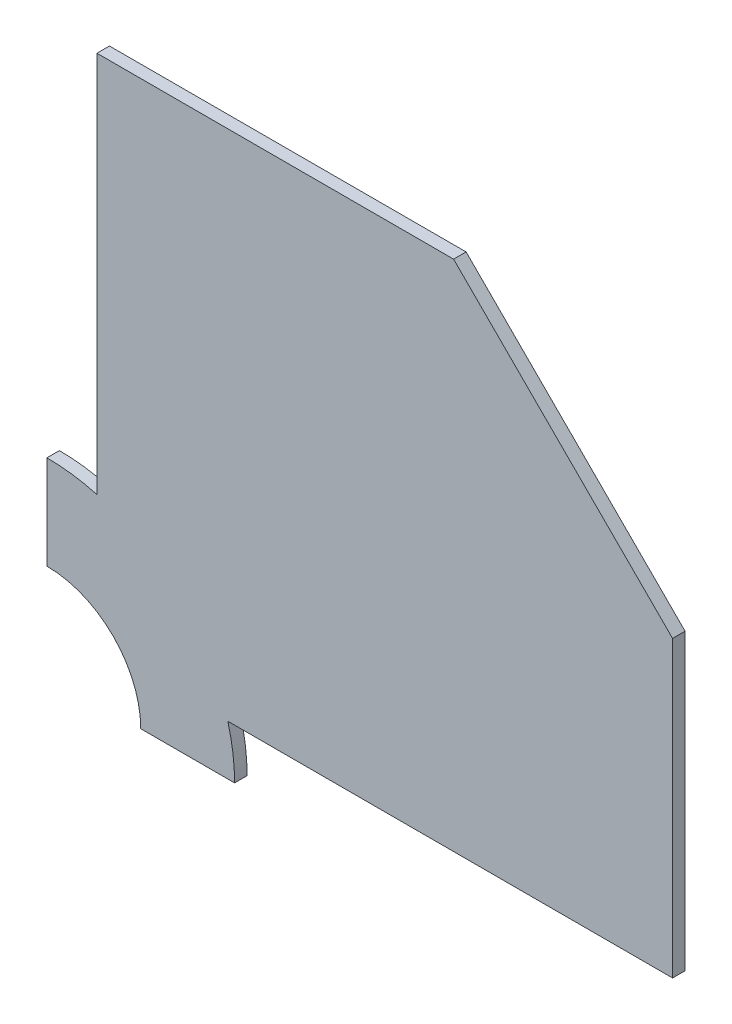
ISO-10303-21;
HEADER;
FILE_DESCRIPTION(('STEP AP214'),'2;1');
FILE_NAME('part.step','',(''),(''),'','','');
FILE_SCHEMA(('AUTOMOTIVE_DESIGN { 1 0 10303 214 1 1 1 1 }'));
ENDSEC;
DATA;
#1=APPLICATION_CONTEXT('core data for automotive mechanical design processes');
#2=APPLICATION_PROTOCOL_DEFINITION('international standard','automotive_design',2000,#1);
#3=PRODUCT_CONTEXT('',#1,'mechanical');
#4=PRODUCT('Part','Part','',(#3));
#5=PRODUCT_RELATED_PRODUCT_CATEGORY('part','',(#4));
#6=PRODUCT_DEFINITION_FORMATION('','',#4);
#7=PRODUCT_DEFINITION_CONTEXT('part definition',#1,'design');
#8=PRODUCT_DEFINITION('design','',#6,#7);
#9=PRODUCT_DEFINITION_SHAPE('','',#8);
#10=(LENGTH_UNIT() NAMED_UNIT(*) SI_UNIT(.MILLI.,.METRE.));
#11=(NAMED_UNIT(*) PLANE_ANGLE_UNIT() SI_UNIT($,.RADIAN.));
#12=(NAMED_UNIT(*) SI_UNIT($,.STERADIAN.) SOLID_ANGLE_UNIT());
#13=UNCERTAINTY_MEASURE_WITH_UNIT(LENGTH_MEASURE(1.E-05),#10,'distance_accuracy_value','');
#14=(GEOMETRIC_REPRESENTATION_CONTEXT(3) GLOBAL_UNCERTAINTY_ASSIGNED_CONTEXT((#13)) GLOBAL_UNIT_ASSIGNED_CONTEXT((#10,
#11,#12)) REPRESENTATION_CONTEXT('',''));
#15=CARTESIAN_POINT('',(0.,0.,0.));
#16=DIRECTION('',(0.,0.,1.));
#17=DIRECTION('',(1.,0.,0.));
#18=AXIS2_PLACEMENT_3D('',#15,#16,#17);
#19=CARTESIAN_POINT('',(-1.6,-1.25,-0.02));
#20=DIRECTION('',(0.,0.,-1.));
#21=DIRECTION('',(-1.,0.,0.));
#22=AXIS2_PLACEMENT_3D('',#19,#20,#21);
#23=PLANE('',#22);
#24=DIRECTION('',(0.,1.,0.));
#25=VECTOR('',#24,1.);
#26=CARTESIAN_POINT('',(-1.52,-0.960863354104,-0.02));
#27=LINE('',#26,#25);
#28=CARTESIAN_POINT('',(-1.52,-0.96086335410399,-0.02));
#29=VERTEX_POINT('',#28);
#30=CARTESIAN_POINT('',(-1.52,-0.35,-0.02));
#31=VERTEX_POINT('',#30);
#32=EDGE_CURVE('E115',#29,#31,#27,.T.);
#33=ORIENTED_EDGE('',*,*,#32,.T.);
#34=DIRECTION('',(1.,0.,0.));
#35=VECTOR('',#34,1.);
#36=CARTESIAN_POINT('',(-1.52,-0.35,-0.02));
#37=LINE('',#36,#35);
#38=CARTESIAN_POINT('',(-0.95,-0.35,-0.02));
#39=VERTEX_POINT('',#38);
#40=EDGE_CURVE('E98',#31,#39,#37,.T.);
#41=ORIENTED_EDGE('',*,*,#40,.T.);
#42=DIRECTION('',(0.707106781186548,-0.707106781186548,0.));
#43=VECTOR('',#42,1.);
#44=CARTESIAN_POINT('',(-0.95,-0.35,-0.02));
#45=LINE('',#44,#43);
#46=CARTESIAN_POINT('',(-0.6,-0.7,-0.02));
#47=VERTEX_POINT('',#46);
#48=EDGE_CURVE('E190',#39,#47,#45,.T.);
#49=ORIENTED_EDGE('',*,*,#48,.T.);
#50=DIRECTION('',(0.,1.,0.));
#51=VECTOR('',#50,1.);
#52=CARTESIAN_POINT('',(-0.6,-0.7,-0.02));
#53=LINE('',#52,#51);
#54=CARTESIAN_POINT('',(-0.6,-1.17,-0.02));
#55=VERTEX_POINT('',#54);
#56=EDGE_CURVE('E79',#47,#55,#53,.F.);
#57=ORIENTED_EDGE('',*,*,#56,.T.);
#58=DIRECTION('',(1.,0.,0.));
#59=VECTOR('',#58,1.);
#60=CARTESIAN_POINT('',(-0.6,-1.17,-0.02));
#61=LINE('',#60,#59);
#62=CARTESIAN_POINT('',(-1.31086335410398,-1.17,-0.02));
#63=VERTEX_POINT('',#62);
#64=EDGE_CURVE('E181',#55,#63,#61,.F.);
#65=ORIENTED_EDGE('',*,*,#64,.T.);
#66=CARTESIAN_POINT('',(-1.6,-1.25,-0.02));
#67=DIRECTION('',(0.,0.,1.));
#68=DIRECTION('',(1.,0.,0.));
#69=AXIS2_PLACEMENT_3D('',#66,#67,#68);
#70=CIRCLE('',#69,0.3);
#71=CARTESIAN_POINT('',(-1.3,-1.25,-0.02));
#72=VERTEX_POINT('',#71);
#73=EDGE_CURVE('E20',#72,#63,#70,.T.);
#74=ORIENTED_EDGE('',*,*,#73,.F.);
#75=DIRECTION('',(1.,0.,0.));
#76=VECTOR('',#75,1.);
#77=CARTESIAN_POINT('',(-1.3,-1.25,-0.02));
#78=LINE('',#77,#76);
#79=CARTESIAN_POINT('',(-1.45,-1.25,-0.02));
#80=VERTEX_POINT('',#79);
#81=EDGE_CURVE('E177',#72,#80,#78,.F.);
#82=ORIENTED_EDGE('',*,*,#81,.T.);
#83=CARTESIAN_POINT('',(-1.6,-1.25,-0.02));
#84=DIRECTION('',(0.,0.,1.));
#85=DIRECTION('',(1.,0.,0.));
#86=AXIS2_PLACEMENT_3D('',#83,#84,#85);
#87=CIRCLE('',#86,0.15);
#88=CARTESIAN_POINT('',(-1.6,-1.1,-0.02));
#89=VERTEX_POINT('',#88);
#90=EDGE_CURVE('E205',#80,#89,#87,.T.);
#91=ORIENTED_EDGE('',*,*,#90,.T.);
#92=DIRECTION('',(0.,1.,0.));
#93=VECTOR('',#92,1.);
#94=CARTESIAN_POINT('',(-1.6,-1.1,-0.02));
#95=LINE('',#94,#93);
#96=CARTESIAN_POINT('',(-1.6,-0.95,-0.02));
#97=VERTEX_POINT('',#96);
#98=EDGE_CURVE('E174',#89,#97,#95,.T.);
#99=ORIENTED_EDGE('',*,*,#98,.T.);
#100=CARTESIAN_POINT('',(-1.6,-1.25,-0.02));
#101=DIRECTION('',(0.,0.,1.));
#102=DIRECTION('',(1.,0.,0.));
#103=AXIS2_PLACEMENT_3D('',#100,#101,#102);
#104=CIRCLE('',#103,0.3);
#105=EDGE_CURVE('E164',#29,#97,#104,.T.);
#106=ORIENTED_EDGE('',*,*,#105,.F.);
#107=EDGE_LOOP('',(#33,#41,#49,#57,#65,#74,#82,#91,#99,#106));
#108=FACE_BOUND('',#107,.T.);
#109=ADVANCED_FACE('F17',(#108),#23,.T.);
#110=CARTESIAN_POINT('',(-1.52,-0.35,-0.02));
#111=DIRECTION('',(0.,-1.,0.));
#112=DIRECTION('',(0.,0.,-1.));
#113=AXIS2_PLACEMENT_3D('',#110,#111,#112);
#114=PLANE('',#113);
#115=ORIENTED_EDGE('',*,*,#40,.F.);
#116=DIRECTION('',(0.,0.,-1.));
#117=VECTOR('',#116,1.);
#118=CARTESIAN_POINT('',(-1.52,-0.35,-0.02));
#119=LINE('',#118,#117);
#120=CARTESIAN_POINT('',(-1.52,-0.35,0.));
#121=VERTEX_POINT('',#120);
#122=EDGE_CURVE('E111',#31,#121,#119,.F.);
#123=ORIENTED_EDGE('',*,*,#122,.T.);
#124=DIRECTION('',(-1.,0.,0.));
#125=VECTOR('',#124,1.);
#126=CARTESIAN_POINT('',(-1.6,-0.35,0.));
#127=LINE('',#126,#125);
#128=CARTESIAN_POINT('',(-0.95,-0.35,0.));
#129=VERTEX_POINT('',#128);
#130=EDGE_CURVE('E104',#121,#129,#127,.F.);
#131=ORIENTED_EDGE('',*,*,#130,.T.);
#132=DIRECTION('',(0.,0.,1.));
#133=VECTOR('',#132,1.);
#134=CARTESIAN_POINT('',(-0.95,-0.35,-0.02));
#135=LINE('',#134,#133);
#136=EDGE_CURVE('E192',#129,#39,#135,.F.);
#137=ORIENTED_EDGE('',*,*,#136,.T.);
#138=EDGE_LOOP('',(#115,#123,#131,#137));
#139=FACE_BOUND('',#138,.T.);
#140=ADVANCED_FACE('F113',(#139),#114,.F.);
#141=CARTESIAN_POINT('',(-0.95,-0.35,-0.02));
#142=DIRECTION('',(-0.707106781186548,-0.707106781186548,0.));
#143=DIRECTION('',(0.707106781186548,-0.707106781186548,0.));
#144=AXIS2_PLACEMENT_3D('',#141,#142,#143);
#145=PLANE('',#144);
#146=ORIENTED_EDGE('',*,*,#48,.F.);
#147=ORIENTED_EDGE('',*,*,#136,.F.);
#148=DIRECTION('',(0.707106781186547,-0.707106781186547,0.));
#149=VECTOR('',#148,1.);
#150=CARTESIAN_POINT('',(-0.95,-0.35,0.));
#151=LINE('',#150,#149);
#152=CARTESIAN_POINT('',(-0.6,-0.7,0.));
#153=VERTEX_POINT('',#152);
#154=EDGE_CURVE('E110',#129,#153,#151,.T.);
#155=ORIENTED_EDGE('',*,*,#154,.T.);
#156=DIRECTION('',(0.,0.,1.));
#157=VECTOR('',#156,1.);
#158=CARTESIAN_POINT('',(-0.6,-0.7,-0.02));
#159=LINE('',#158,#157);
#160=EDGE_CURVE('E187',#153,#47,#159,.F.);
#161=ORIENTED_EDGE('',*,*,#160,.T.);
#162=EDGE_LOOP('',(#146,#147,#155,#161));
#163=FACE_BOUND('',#162,.T.);
#164=ADVANCED_FACE('F152',(#163),#145,.F.);
#165=CARTESIAN_POINT('',(-0.6,-0.7,-0.02));
#166=DIRECTION('',(-1.,0.,0.));
#167=DIRECTION('',(0.,0.,1.));
#168=AXIS2_PLACEMENT_3D('',#165,#166,#167);
#169=PLANE('',#168);
#170=ORIENTED_EDGE('',*,*,#56,.F.);
#171=ORIENTED_EDGE('',*,*,#160,.F.);
#172=DIRECTION('',(0.,1.,0.));
#173=VECTOR('',#172,1.);
#174=CARTESIAN_POINT('',(-0.6,-1.25,0.));
#175=LINE('',#174,#173);
#176=CARTESIAN_POINT('',(-0.6,-1.17,0.));
#177=VERTEX_POINT('',#176);
#178=EDGE_CURVE('E222',#153,#177,#175,.F.);
#179=ORIENTED_EDGE('',*,*,#178,.T.);
#180=DIRECTION('',(0.,0.,1.));
#181=VECTOR('',#180,1.);
#182=CARTESIAN_POINT('',(-0.6,-1.17,-0.02));
#183=LINE('',#182,#181);
#184=EDGE_CURVE('E183',#177,#55,#183,.F.);
#185=ORIENTED_EDGE('',*,*,#184,.T.);
#186=EDGE_LOOP('',(#170,#171,#179,#185));
#187=FACE_BOUND('',#186,.T.);
#188=ADVANCED_FACE('F148',(#187),#169,.F.);
#189=CARTESIAN_POINT('',(-0.6,-1.17,-0.02));
#190=DIRECTION('',(0.,1.,0.));
#191=DIRECTION('',(0.,0.,1.));
#192=AXIS2_PLACEMENT_3D('',#189,#190,#191);
#193=PLANE('',#192);
#194=ORIENTED_EDGE('',*,*,#64,.F.);
#195=ORIENTED_EDGE('',*,*,#184,.F.);
#196=DIRECTION('',(-1.,0.,0.));
#197=VECTOR('',#196,1.);
#198=CARTESIAN_POINT('',(-1.6,-1.17,0.));
#199=LINE('',#198,#197);
#200=CARTESIAN_POINT('',(-1.31086335410398,-1.17,0.));
#201=VERTEX_POINT('',#200);
#202=EDGE_CURVE('E204',#177,#201,#199,.T.);
#203=ORIENTED_EDGE('',*,*,#202,.T.);
#204=DIRECTION('',(0.,0.,1.));
#205=VECTOR('',#204,1.);
#206=CARTESIAN_POINT('',(-1.31086335410398,-1.17,-0.02));
#207=LINE('',#206,#205);
#208=EDGE_CURVE('E216',#63,#201,#207,.T.);
#209=ORIENTED_EDGE('',*,*,#208,.F.);
#210=EDGE_LOOP('',(#194,#195,#203,#209));
#211=FACE_BOUND('',#210,.T.);
#212=ADVANCED_FACE('F145',(#211),#193,.F.);
#213=CARTESIAN_POINT('',(-1.6,-1.25,-0.02));
#214=DIRECTION('',(0.,0.,1.));
#215=DIRECTION('',(1.,0.,0.));
#216=AXIS2_PLACEMENT_3D('',#213,#214,#215);
#217=CYLINDRICAL_SURFACE('',#216,0.3);
#218=ORIENTED_EDGE('',*,*,#208,.T.);
#219=CARTESIAN_POINT('',(-1.6,-1.25,0.));
#220=DIRECTION('',(0.,0.,1.));
#221=DIRECTION('',(1.,0.,0.));
#222=AXIS2_PLACEMENT_3D('',#219,#220,#221);
#223=CIRCLE('',#222,0.3);
#224=CARTESIAN_POINT('',(-1.3,-1.25,0.));
#225=VERTEX_POINT('',#224);
#226=EDGE_CURVE('E201',#201,#225,#223,.F.);
#227=ORIENTED_EDGE('',*,*,#226,.T.);
#228=DIRECTION('',(0.,0.,1.));
#229=VECTOR('',#228,1.);
#230=CARTESIAN_POINT('',(-1.3,-1.25,-0.02));
#231=LINE('',#230,#229);
#232=EDGE_CURVE('E180',#225,#72,#231,.F.);
#233=ORIENTED_EDGE('',*,*,#232,.T.);
#234=ORIENTED_EDGE('',*,*,#73,.T.);
#235=EDGE_LOOP('',(#218,#227,#233,#234));
#236=FACE_BOUND('',#235,.T.);
#237=ADVANCED_FACE('F141',(#236),#217,.T.);
#238=CARTESIAN_POINT('',(-1.3,-1.25,-0.02));
#239=DIRECTION('',(0.,1.,0.));
#240=DIRECTION('',(0.,0.,1.));
#241=AXIS2_PLACEMENT_3D('',#238,#239,#240);
#242=PLANE('',#241);
#243=ORIENTED_EDGE('',*,*,#81,.F.);
#244=ORIENTED_EDGE('',*,*,#232,.F.);
#245=DIRECTION('',(-1.,0.,0.));
#246=VECTOR('',#245,1.);
#247=CARTESIAN_POINT('',(-1.6,-1.25,0.));
#248=LINE('',#247,#246);
#249=CARTESIAN_POINT('',(-1.45,-1.25,0.));
#250=VERTEX_POINT('',#249);
#251=EDGE_CURVE('E200',#225,#250,#248,.T.);
#252=ORIENTED_EDGE('',*,*,#251,.T.);
#253=DIRECTION('',(0.,0.,1.));
#254=VECTOR('',#253,1.);
#255=CARTESIAN_POINT('',(-1.45,-1.25,-0.02));
#256=LINE('',#255,#254);
#257=EDGE_CURVE('E179',#250,#80,#256,.F.);
#258=ORIENTED_EDGE('',*,*,#257,.T.);
#259=EDGE_LOOP('',(#243,#244,#252,#258));
#260=FACE_BOUND('',#259,.T.);
#261=ADVANCED_FACE('F137',(#260),#242,.F.);
#262=CARTESIAN_POINT('',(-1.6,-1.25,-0.02));
#263=DIRECTION('',(0.,0.,1.));
#264=DIRECTION('',(1.,0.,0.));
#265=AXIS2_PLACEMENT_3D('',#262,#263,#264);
#266=CYLINDRICAL_SURFACE('',#265,0.15);
#267=ORIENTED_EDGE('',*,*,#90,.F.);
#268=ORIENTED_EDGE('',*,*,#257,.F.);
#269=CARTESIAN_POINT('',(-1.6,-1.25,0.));
#270=DIRECTION('',(0.,0.,1.));
#271=DIRECTION('',(1.,0.,0.));
#272=AXIS2_PLACEMENT_3D('',#269,#270,#271);
#273=CIRCLE('',#272,0.15);
#274=CARTESIAN_POINT('',(-1.6,-1.1,0.));
#275=VERTEX_POINT('',#274);
#276=EDGE_CURVE('E197',#250,#275,#273,.T.);
#277=ORIENTED_EDGE('',*,*,#276,.T.);
#278=DIRECTION('',(0.,0.,-1.));
#279=VECTOR('',#278,1.);
#280=CARTESIAN_POINT('',(-1.6,-1.1,-0.02));
#281=LINE('',#280,#279);
#282=EDGE_CURVE('E176',#275,#89,#281,.T.);
#283=ORIENTED_EDGE('',*,*,#282,.T.);
#284=EDGE_LOOP('',(#267,#268,#277,#283));
#285=FACE_BOUND('',#284,.T.);
#286=ADVANCED_FACE('F133',(#285),#266,.F.);
#287=CARTESIAN_POINT('',(-1.6,-1.1,-0.02));
#288=DIRECTION('',(1.,0.,0.));
#289=DIRECTION('',(0.,0.,-1.));
#290=AXIS2_PLACEMENT_3D('',#287,#288,#289);
#291=PLANE('',#290);
#292=ORIENTED_EDGE('',*,*,#98,.F.);
#293=ORIENTED_EDGE('',*,*,#282,.F.);
#294=DIRECTION('',(0.,1.,0.));
#295=VECTOR('',#294,1.);
#296=CARTESIAN_POINT('',(-1.6,-1.25,0.));
#297=LINE('',#296,#295);
#298=CARTESIAN_POINT('',(-1.6,-0.95,0.));
#299=VERTEX_POINT('',#298);
#300=EDGE_CURVE('E196',#275,#299,#297,.T.);
#301=ORIENTED_EDGE('',*,*,#300,.T.);
#302=DIRECTION('',(0.,0.,1.));
#303=VECTOR('',#302,1.);
#304=CARTESIAN_POINT('',(-1.6,-0.95,-0.02));
#305=LINE('',#304,#303);
#306=EDGE_CURVE('E166',#97,#299,#305,.T.);
#307=ORIENTED_EDGE('',*,*,#306,.F.);
#308=EDGE_LOOP('',(#292,#293,#301,#307));
#309=FACE_BOUND('',#308,.T.);
#310=ADVANCED_FACE('F127',(#309),#291,.F.);
#311=CARTESIAN_POINT('',(-1.6,-1.25,-0.02));
#312=DIRECTION('',(0.,0.,1.));
#313=DIRECTION('',(1.,0.,0.));
#314=AXIS2_PLACEMENT_3D('',#311,#312,#313);
#315=CYLINDRICAL_SURFACE('',#314,0.3);
#316=ORIENTED_EDGE('',*,*,#306,.T.);
#317=CARTESIAN_POINT('',(-1.6,-1.25,0.));
#318=DIRECTION('',(0.,0.,1.));
#319=DIRECTION('',(1.,0.,0.));
#320=AXIS2_PLACEMENT_3D('',#317,#318,#319);
#321=CIRCLE('',#320,0.3);
#322=CARTESIAN_POINT('',(-1.52,-0.96086335410399,0.));
#323=VERTEX_POINT('',#322);
#324=EDGE_CURVE('E26',#299,#323,#321,.F.);
#325=ORIENTED_EDGE('',*,*,#324,.T.);
#326=DIRECTION('',(0.,0.,-1.));
#327=VECTOR('',#326,1.);
#328=CARTESIAN_POINT('',(-1.52,-0.960863354104,-0.02));
#329=LINE('',#328,#327);
#330=EDGE_CURVE('E34',#323,#29,#329,.T.);
#331=ORIENTED_EDGE('',*,*,#330,.T.);
#332=ORIENTED_EDGE('',*,*,#105,.T.);
#333=EDGE_LOOP('',(#316,#325,#331,#332));
#334=FACE_BOUND('',#333,.T.);
#335=ADVANCED_FACE('F119',(#334),#315,.T.);
#336=CARTESIAN_POINT('',(-1.52,-0.960863354104,-0.02));
#337=DIRECTION('',(1.,0.,0.));
#338=DIRECTION('',(0.,0.,-1.));
#339=AXIS2_PLACEMENT_3D('',#336,#337,#338);
#340=PLANE('',#339);
#341=ORIENTED_EDGE('',*,*,#32,.F.);
#342=ORIENTED_EDGE('',*,*,#330,.F.);
#343=DIRECTION('',(0.,1.,0.));
#344=VECTOR('',#343,1.);
#345=CARTESIAN_POINT('',(-1.52,-1.25,0.));
#346=LINE('',#345,#344);
#347=EDGE_CURVE('E11',#323,#121,#346,.T.);
#348=ORIENTED_EDGE('',*,*,#347,.T.);
#349=ORIENTED_EDGE('',*,*,#122,.F.);
#350=EDGE_LOOP('',(#341,#342,#348,#349));
#351=FACE_BOUND('',#350,.T.);
#352=ADVANCED_FACE('F117',(#351),#340,.F.);
#353=CARTESIAN_POINT('',(-1.6,-1.25,0.));
#354=DIRECTION('',(0.,0.,-1.));
#355=DIRECTION('',(-1.,0.,0.));
#356=AXIS2_PLACEMENT_3D('',#353,#354,#355);
#357=PLANE('',#356);
#358=ORIENTED_EDGE('',*,*,#324,.F.);
#359=ORIENTED_EDGE('',*,*,#300,.F.);
#360=ORIENTED_EDGE('',*,*,#276,.F.);
#361=ORIENTED_EDGE('',*,*,#251,.F.);
#362=ORIENTED_EDGE('',*,*,#226,.F.);
#363=ORIENTED_EDGE('',*,*,#202,.F.);
#364=ORIENTED_EDGE('',*,*,#178,.F.);
#365=ORIENTED_EDGE('',*,*,#154,.F.);
#366=ORIENTED_EDGE('',*,*,#130,.F.);
#367=ORIENTED_EDGE('',*,*,#347,.F.);
#368=EDGE_LOOP('',(#358,#359,#360,#361,#362,#363,#364,#365,#366,#367));
#369=FACE_BOUND('',#368,.T.);
#370=ADVANCED_FACE('F106',(#369),#357,.F.);
#371=CLOSED_SHELL('',(#109,#140,#164,#188,#212,#237,#261,#286,#310,#335,#352,#370));
#372=MANIFOLD_SOLID_BREP('B1',#371);
#373=ADVANCED_BREP_SHAPE_REPRESENTATION('',(#18,#372),#14);
#374=SHAPE_DEFINITION_REPRESENTATION(#9,#373);
ENDSEC;
END-ISO-10303-21;
